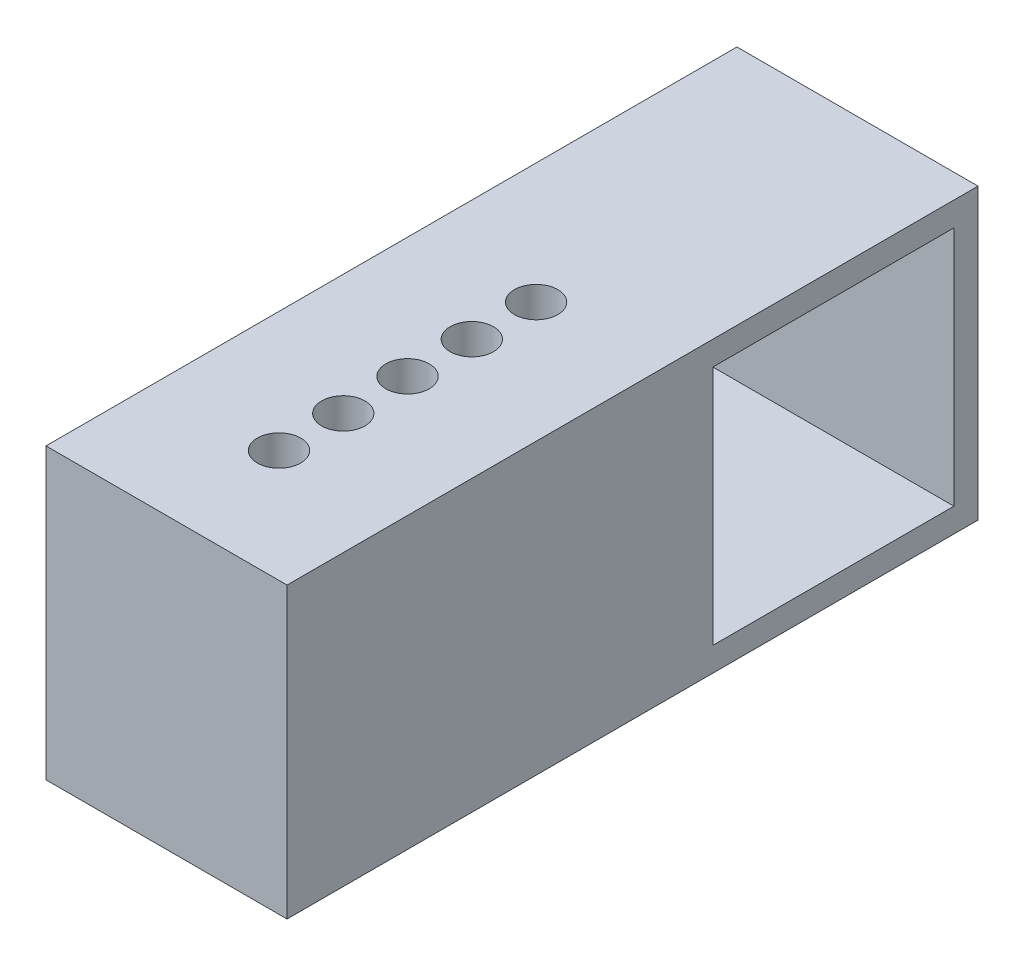
ISO-10303-21;
HEADER;
FILE_DESCRIPTION(('STEP AP214'),'2;1');
FILE_NAME('part.step','',(''),(''),'','','');
FILE_SCHEMA(('AUTOMOTIVE_DESIGN { 1 0 10303 214 1 1 1 1 }'));
ENDSEC;
DATA;
#1=APPLICATION_CONTEXT('core data for automotive mechanical design processes');
#2=APPLICATION_PROTOCOL_DEFINITION('international standard','automotive_design',2000,#1);
#3=PRODUCT_CONTEXT('',#1,'mechanical');
#4=PRODUCT('Part','Part','',(#3));
#5=PRODUCT_RELATED_PRODUCT_CATEGORY('part','',(#4));
#6=PRODUCT_DEFINITION_FORMATION('','',#4);
#7=PRODUCT_DEFINITION_CONTEXT('part definition',#1,'design');
#8=PRODUCT_DEFINITION('design','',#6,#7);
#9=PRODUCT_DEFINITION_SHAPE('','',#8);
#10=(LENGTH_UNIT() NAMED_UNIT(*) SI_UNIT(.MILLI.,.METRE.));
#11=(NAMED_UNIT(*) PLANE_ANGLE_UNIT() SI_UNIT($,.RADIAN.));
#12=(NAMED_UNIT(*) SI_UNIT($,.STERADIAN.) SOLID_ANGLE_UNIT());
#13=UNCERTAINTY_MEASURE_WITH_UNIT(LENGTH_MEASURE(1.E-05),#10,'distance_accuracy_value','');
#14=(GEOMETRIC_REPRESENTATION_CONTEXT(3) GLOBAL_UNCERTAINTY_ASSIGNED_CONTEXT((#13)) GLOBAL_UNIT_ASSIGNED_CONTEXT((#10,
#11,#12)) REPRESENTATION_CONTEXT('',''));
#15=CARTESIAN_POINT('',(0.,0.,0.));
#16=DIRECTION('',(0.,0.,1.));
#17=DIRECTION('',(1.,0.,0.));
#18=AXIS2_PLACEMENT_3D('',#15,#16,#17);
#19=CARTESIAN_POINT('',(15.,0.,-7.5));
#20=DIRECTION('',(0.,0.,1.));
#21=DIRECTION('',(1.,0.,0.));
#22=AXIS2_PLACEMENT_3D('',#19,#20,#21);
#23=PLANE('',#22);
#24=DIRECTION('',(0.,1.,0.));
#25=VECTOR('',#24,1.);
#26=CARTESIAN_POINT('',(0.,0.,-7.5));
#27=LINE('',#26,#25);
#28=CARTESIAN_POINT('',(0.,-7.5,-7.5));
#29=VERTEX_POINT('',#28);
#30=CARTESIAN_POINT('',(0.,7.5,-7.5));
#31=VERTEX_POINT('',#30);
#32=EDGE_CURVE('E165',#29,#31,#27,.T.);
#33=ORIENTED_EDGE('',*,*,#32,.F.);
#34=DIRECTION('',(-1.,0.,0.));
#35=VECTOR('',#34,1.);
#36=CARTESIAN_POINT('',(15.,-7.5,-7.5));
#37=LINE('',#36,#35);
#38=CARTESIAN_POINT('',(15.,-7.5,-7.5));
#39=VERTEX_POINT('',#38);
#40=EDGE_CURVE('E11',#39,#29,#37,.T.);
#41=ORIENTED_EDGE('',*,*,#40,.F.);
#42=DIRECTION('',(0.,1.,0.));
#43=VECTOR('',#42,1.);
#44=CARTESIAN_POINT('',(15.,0.,-7.5));
#45=LINE('',#44,#43);
#46=CARTESIAN_POINT('',(15.,7.5,-7.5));
#47=VERTEX_POINT('',#46);
#48=EDGE_CURVE('E141',#39,#47,#45,.T.);
#49=ORIENTED_EDGE('',*,*,#48,.T.);
#50=DIRECTION('',(-1.,0.,0.));
#51=VECTOR('',#50,1.);
#52=CARTESIAN_POINT('',(15.,7.5,-7.5));
#53=LINE('',#52,#51);
#54=EDGE_CURVE('E100',#47,#31,#53,.T.);
#55=ORIENTED_EDGE('',*,*,#54,.T.);
#56=EDGE_LOOP('',(#33,#41,#49,#55));
#57=FACE_BOUND('',#56,.T.);
#58=ADVANCED_FACE('F45',(#57),#23,.T.);
#59=CARTESIAN_POINT('',(15.,-7.5,0.));
#60=DIRECTION('',(0.,1.,0.));
#61=DIRECTION('',(0.,0.,1.));
#62=AXIS2_PLACEMENT_3D('',#59,#60,#61);
#63=PLANE('',#62);
#64=DIRECTION('',(0.,0.,-1.));
#65=VECTOR('',#64,1.);
#66=CARTESIAN_POINT('',(0.,-7.5,0.));
#67=LINE('',#66,#65);
#68=CARTESIAN_POINT('',(0.,-7.5,7.5));
#69=VERTEX_POINT('',#68);
#70=EDGE_CURVE('E129',#69,#29,#67,.T.);
#71=ORIENTED_EDGE('',*,*,#70,.F.);
#72=DIRECTION('',(-1.,0.,0.));
#73=VECTOR('',#72,1.);
#74=CARTESIAN_POINT('',(15.,-7.5,7.5));
#75=LINE('',#74,#73);
#76=CARTESIAN_POINT('',(15.,-7.5,7.5));
#77=VERTEX_POINT('',#76);
#78=EDGE_CURVE('E56',#77,#69,#75,.T.);
#79=ORIENTED_EDGE('',*,*,#78,.F.);
#80=DIRECTION('',(0.,0.,-1.));
#81=VECTOR('',#80,1.);
#82=CARTESIAN_POINT('',(15.,-7.5,0.));
#83=LINE('',#82,#81);
#84=EDGE_CURVE('E127',#77,#39,#83,.T.);
#85=ORIENTED_EDGE('',*,*,#84,.T.);
#86=ORIENTED_EDGE('',*,*,#40,.T.);
#87=EDGE_LOOP('',(#71,#79,#85,#86));
#88=FACE_BOUND('',#87,.T.);
#89=ADVANCED_FACE('F125',(#88),#63,.T.);
#90=CARTESIAN_POINT('',(15.,0.,7.5));
#91=DIRECTION('',(0.,0.,1.));
#92=DIRECTION('',(1.,0.,0.));
#93=AXIS2_PLACEMENT_3D('',#90,#91,#92);
#94=PLANE('',#93);
#95=DIRECTION('',(0.,1.,0.));
#96=VECTOR('',#95,1.);
#97=CARTESIAN_POINT('',(0.,0.,7.5));
#98=LINE('',#97,#96);
#99=CARTESIAN_POINT('',(0.,7.5,7.5));
#100=VERTEX_POINT('',#99);
#101=EDGE_CURVE('E170',#69,#100,#98,.T.);
#102=ORIENTED_EDGE('',*,*,#101,.T.);
#103=DIRECTION('',(-1.,0.,0.));
#104=VECTOR('',#103,1.);
#105=CARTESIAN_POINT('',(15.,7.5,7.5));
#106=LINE('',#105,#104);
#107=CARTESIAN_POINT('',(15.,7.5,7.5));
#108=VERTEX_POINT('',#107);
#109=EDGE_CURVE('E133',#108,#100,#106,.T.);
#110=ORIENTED_EDGE('',*,*,#109,.F.);
#111=DIRECTION('',(0.,1.,0.));
#112=VECTOR('',#111,1.);
#113=CARTESIAN_POINT('',(15.,0.,7.5));
#114=LINE('',#113,#112);
#115=EDGE_CURVE('E136',#77,#108,#114,.T.);
#116=ORIENTED_EDGE('',*,*,#115,.F.);
#117=ORIENTED_EDGE('',*,*,#78,.T.);
#118=EDGE_LOOP('',(#102,#110,#116,#117));
#119=FACE_BOUND('',#118,.T.);
#120=ADVANCED_FACE('F137',(#119),#94,.F.);
#121=CARTESIAN_POINT('',(15.,0.,34.));
#122=DIRECTION('',(0.,0.,-1.));
#123=DIRECTION('',(0.,1.,0.));
#124=AXIS2_PLACEMENT_3D('',#121,#122,#123);
#125=PLANE('',#124);
#126=DIRECTION('',(0.,-1.,0.));
#127=VECTOR('',#126,1.);
#128=CARTESIAN_POINT('',(0.,0.,34.));
#129=LINE('',#128,#127);
#130=CARTESIAN_POINT('',(0.,9.,34.));
#131=VERTEX_POINT('',#130);
#132=CARTESIAN_POINT('',(0.,-9.,34.));
#133=VERTEX_POINT('',#132);
#134=EDGE_CURVE('E152',#131,#133,#129,.T.);
#135=ORIENTED_EDGE('',*,*,#134,.T.);
#136=DIRECTION('',(-1.,0.,0.));
#137=VECTOR('',#136,1.);
#138=CARTESIAN_POINT('',(15.,-9.,34.));
#139=LINE('',#138,#137);
#140=CARTESIAN_POINT('',(15.,-9.,34.));
#141=VERTEX_POINT('',#140);
#142=EDGE_CURVE('E178',#141,#133,#139,.T.);
#143=ORIENTED_EDGE('',*,*,#142,.F.);
#144=DIRECTION('',(0.,-1.,0.));
#145=VECTOR('',#144,1.);
#146=CARTESIAN_POINT('',(15.,0.,34.));
#147=LINE('',#146,#145);
#148=CARTESIAN_POINT('',(15.,9.,34.));
#149=VERTEX_POINT('',#148);
#150=EDGE_CURVE('E175',#149,#141,#147,.T.);
#151=ORIENTED_EDGE('',*,*,#150,.F.);
#152=DIRECTION('',(-1.,0.,0.));
#153=VECTOR('',#152,1.);
#154=CARTESIAN_POINT('',(15.,9.,34.));
#155=LINE('',#154,#153);
#156=EDGE_CURVE('E151',#149,#131,#155,.T.);
#157=ORIENTED_EDGE('',*,*,#156,.T.);
#158=EDGE_LOOP('',(#135,#143,#151,#157));
#159=FACE_BOUND('',#158,.T.);
#160=ADVANCED_FACE('F47',(#159),#125,.F.);
#161=CARTESIAN_POINT('',(15.,-9.,0.));
#162=DIRECTION('',(0.,1.,0.));
#163=DIRECTION('',(0.,0.,1.));
#164=AXIS2_PLACEMENT_3D('',#161,#162,#163);
#165=PLANE('',#164);
#166=CARTESIAN_POINT('',(7.5,-9.,31.));
#167=DIRECTION('',(0.,-1.,0.));
#168=DIRECTION('',(0.,0.,-1.));
#169=AXIS2_PLACEMENT_3D('',#166,#167,#168);
#170=CIRCLE('',#169,1.35);
#171=CARTESIAN_POINT('',(7.5,-9.,29.65));
#172=VERTEX_POINT('',#171);
#173=EDGE_CURVE('E255',#172,#172,#170,.T.);
#174=ORIENTED_EDGE('',*,*,#173,.F.);
#175=EDGE_LOOP('',(#174));
#176=FACE_BOUND('',#175,.T.);
#177=CARTESIAN_POINT('',(7.49999999999994,-9.00000000000001,15.));
#178=DIRECTION('',(0.,1.,0.));
#179=DIRECTION('',(0.,0.,1.));
#180=AXIS2_PLACEMENT_3D('',#177,#178,#179);
#181=CIRCLE('',#180,1.35);
#182=CARTESIAN_POINT('',(7.49999999999994,-9.00000000000001,16.35));
#183=VERTEX_POINT('',#182);
#184=EDGE_CURVE('E199',#183,#183,#181,.T.);
#185=ORIENTED_EDGE('',*,*,#184,.T.);
#186=EDGE_LOOP('',(#185));
#187=FACE_BOUND('',#186,.T.);
#188=CARTESIAN_POINT('',(7.49999999999996,-9.00000000000001,19.));
#189=DIRECTION('',(0.,1.,0.));
#190=DIRECTION('',(0.,0.,1.));
#191=AXIS2_PLACEMENT_3D('',#188,#189,#190);
#192=CIRCLE('',#191,1.35);
#193=CARTESIAN_POINT('',(7.49999999999996,-9.00000000000001,20.35));
#194=VERTEX_POINT('',#193);
#195=EDGE_CURVE('E261',#194,#194,#192,.T.);
#196=ORIENTED_EDGE('',*,*,#195,.T.);
#197=EDGE_LOOP('',(#196));
#198=FACE_BOUND('',#197,.T.);
#199=CARTESIAN_POINT('',(7.49999999999997,-9.00000000000001,23.));
#200=DIRECTION('',(0.,1.,0.));
#201=DIRECTION('',(0.,0.,1.));
#202=AXIS2_PLACEMENT_3D('',#199,#200,#201);
#203=CIRCLE('',#202,1.35);
#204=CARTESIAN_POINT('',(7.49999999999997,-9.00000000000001,24.35));
#205=VERTEX_POINT('',#204);
#206=EDGE_CURVE('E265',#205,#205,#203,.T.);
#207=ORIENTED_EDGE('',*,*,#206,.T.);
#208=EDGE_LOOP('',(#207));
#209=FACE_BOUND('',#208,.T.);
#210=CARTESIAN_POINT('',(7.49999999999999,-9.00000000000001,27.));
#211=DIRECTION('',(0.,1.,0.));
#212=DIRECTION('',(0.,0.,1.));
#213=AXIS2_PLACEMENT_3D('',#210,#211,#212);
#214=CIRCLE('',#213,1.35);
#215=CARTESIAN_POINT('',(7.49999999999999,-9.00000000000001,28.35));
#216=VERTEX_POINT('',#215);
#217=EDGE_CURVE('E268',#216,#216,#214,.T.);
#218=ORIENTED_EDGE('',*,*,#217,.T.);
#219=EDGE_LOOP('',(#218));
#220=FACE_BOUND('',#219,.T.);
#221=DIRECTION('',(0.,0.,-1.));
#222=VECTOR('',#221,1.);
#223=CARTESIAN_POINT('',(0.,-9.,0.));
#224=LINE('',#223,#222);
#225=CARTESIAN_POINT('',(0.,-9.,-9.));
#226=VERTEX_POINT('',#225);
#227=EDGE_CURVE('E156',#133,#226,#224,.T.);
#228=ORIENTED_EDGE('',*,*,#227,.T.);
#229=DIRECTION('',(-1.,0.,0.));
#230=VECTOR('',#229,1.);
#231=CARTESIAN_POINT('',(15.,-9.,-9.));
#232=LINE('',#231,#230);
#233=CARTESIAN_POINT('',(15.,-9.,-9.));
#234=VERTEX_POINT('',#233);
#235=EDGE_CURVE('E188',#234,#226,#232,.T.);
#236=ORIENTED_EDGE('',*,*,#235,.F.);
#237=DIRECTION('',(0.,0.,-1.));
#238=VECTOR('',#237,1.);
#239=CARTESIAN_POINT('',(15.,-9.,0.));
#240=LINE('',#239,#238);
#241=EDGE_CURVE('E108',#141,#234,#240,.T.);
#242=ORIENTED_EDGE('',*,*,#241,.F.);
#243=ORIENTED_EDGE('',*,*,#142,.T.);
#244=EDGE_LOOP('',(#228,#236,#242,#243));
#245=FACE_BOUND('',#244,.T.);
#246=ADVANCED_FACE('F244',(#176,#187,#198,#209,#220,#245),#165,.F.);
#247=CARTESIAN_POINT('',(15.,0.,-9.));
#248=DIRECTION('',(0.,0.,1.));
#249=DIRECTION('',(1.,0.,0.));
#250=AXIS2_PLACEMENT_3D('',#247,#248,#249);
#251=PLANE('',#250);
#252=DIRECTION('',(0.,1.,0.));
#253=VECTOR('',#252,1.);
#254=CARTESIAN_POINT('',(0.,0.,-9.));
#255=LINE('',#254,#253);
#256=CARTESIAN_POINT('',(0.,9.,-9.));
#257=VERTEX_POINT('',#256);
#258=EDGE_CURVE('E159',#226,#257,#255,.T.);
#259=ORIENTED_EDGE('',*,*,#258,.T.);
#260=DIRECTION('',(-1.,0.,0.));
#261=VECTOR('',#260,1.);
#262=CARTESIAN_POINT('',(15.,9.,-9.));
#263=LINE('',#262,#261);
#264=CARTESIAN_POINT('',(15.,9.,-9.));
#265=VERTEX_POINT('',#264);
#266=EDGE_CURVE('E184',#265,#257,#263,.T.);
#267=ORIENTED_EDGE('',*,*,#266,.F.);
#268=DIRECTION('',(0.,1.,0.));
#269=VECTOR('',#268,1.);
#270=CARTESIAN_POINT('',(15.,0.,-9.));
#271=LINE('',#270,#269);
#272=EDGE_CURVE('E275',#234,#265,#271,.T.);
#273=ORIENTED_EDGE('',*,*,#272,.F.);
#274=ORIENTED_EDGE('',*,*,#235,.T.);
#275=EDGE_LOOP('',(#259,#267,#273,#274));
#276=FACE_BOUND('',#275,.T.);
#277=ADVANCED_FACE('F241',(#276),#251,.F.);
#278=CARTESIAN_POINT('',(15.,9.,0.));
#279=DIRECTION('',(0.,-1.,0.));
#280=DIRECTION('',(0.,0.,-1.));
#281=AXIS2_PLACEMENT_3D('',#278,#279,#280);
#282=PLANE('',#281);
#283=CARTESIAN_POINT('',(7.5,9.,11.));
#284=DIRECTION('',(0.,1.,0.));
#285=DIRECTION('',(0.,0.,1.));
#286=AXIS2_PLACEMENT_3D('',#283,#284,#285);
#287=CIRCLE('',#286,1.35);
#288=CARTESIAN_POINT('',(7.5,9.,12.35));
#289=VERTEX_POINT('',#288);
#290=EDGE_CURVE('E472',#289,#289,#287,.T.);
#291=ORIENTED_EDGE('',*,*,#290,.F.);
#292=EDGE_LOOP('',(#291));
#293=FACE_BOUND('',#292,.T.);
#294=CARTESIAN_POINT('',(7.49999999999994,9.,15.));
#295=DIRECTION('',(0.,-1.,0.));
#296=DIRECTION('',(0.,0.,-1.));
#297=AXIS2_PLACEMENT_3D('',#294,#295,#296);
#298=CIRCLE('',#297,1.35);
#299=CARTESIAN_POINT('',(7.49999999999994,9.,13.65));
#300=VERTEX_POINT('',#299);
#301=EDGE_CURVE('E49',#300,#300,#298,.T.);
#302=ORIENTED_EDGE('',*,*,#301,.T.);
#303=EDGE_LOOP('',(#302));
#304=FACE_BOUND('',#303,.T.);
#305=CARTESIAN_POINT('',(7.49999999999996,9.,19.));
#306=DIRECTION('',(0.,-1.,0.));
#307=DIRECTION('',(0.,0.,-1.));
#308=AXIS2_PLACEMENT_3D('',#305,#306,#307);
#309=CIRCLE('',#308,1.35);
#310=CARTESIAN_POINT('',(7.49999999999996,9.,17.65));
#311=VERTEX_POINT('',#310);
#312=EDGE_CURVE('E202',#311,#311,#309,.T.);
#313=ORIENTED_EDGE('',*,*,#312,.T.);
#314=EDGE_LOOP('',(#313));
#315=FACE_BOUND('',#314,.T.);
#316=CARTESIAN_POINT('',(7.49999999999997,9.,23.));
#317=DIRECTION('',(0.,-1.,0.));
#318=DIRECTION('',(0.,0.,-1.));
#319=AXIS2_PLACEMENT_3D('',#316,#317,#318);
#320=CIRCLE('',#319,1.35);
#321=CARTESIAN_POINT('',(7.49999999999997,9.,21.65));
#322=VERTEX_POINT('',#321);
#323=EDGE_CURVE('E198',#322,#322,#320,.T.);
#324=ORIENTED_EDGE('',*,*,#323,.T.);
#325=EDGE_LOOP('',(#324));
#326=FACE_BOUND('',#325,.T.);
#327=CARTESIAN_POINT('',(7.49999999999999,8.99999999999999,27.));
#328=DIRECTION('',(0.,-1.,0.));
#329=DIRECTION('',(0.,0.,-1.));
#330=AXIS2_PLACEMENT_3D('',#327,#328,#329);
#331=CIRCLE('',#330,1.35);
#332=CARTESIAN_POINT('',(7.49999999999999,8.99999999999999,25.65));
#333=VERTEX_POINT('',#332);
#334=EDGE_CURVE('E194',#333,#333,#331,.T.);
#335=ORIENTED_EDGE('',*,*,#334,.T.);
#336=EDGE_LOOP('',(#335));
#337=FACE_BOUND('',#336,.T.);
#338=DIRECTION('',(0.,0.,1.));
#339=VECTOR('',#338,1.);
#340=CARTESIAN_POINT('',(0.,9.,0.));
#341=LINE('',#340,#339);
#342=EDGE_CURVE('E162',#257,#131,#341,.T.);
#343=ORIENTED_EDGE('',*,*,#342,.T.);
#344=ORIENTED_EDGE('',*,*,#156,.F.);
#345=DIRECTION('',(0.,0.,1.));
#346=VECTOR('',#345,1.);
#347=CARTESIAN_POINT('',(15.,9.,0.));
#348=LINE('',#347,#346);
#349=EDGE_CURVE('E145',#265,#149,#348,.T.);
#350=ORIENTED_EDGE('',*,*,#349,.F.);
#351=ORIENTED_EDGE('',*,*,#266,.T.);
#352=EDGE_LOOP('',(#343,#344,#350,#351));
#353=FACE_BOUND('',#352,.T.);
#354=ADVANCED_FACE('F211',(#293,#304,#315,#326,#337,#353),#282,.F.);
#355=CARTESIAN_POINT('',(15.,7.5,0.));
#356=DIRECTION('',(0.,1.,0.));
#357=DIRECTION('',(0.,0.,1.));
#358=AXIS2_PLACEMENT_3D('',#355,#356,#357);
#359=PLANE('',#358);
#360=DIRECTION('',(0.,0.,-1.));
#361=VECTOR('',#360,1.);
#362=CARTESIAN_POINT('',(0.,7.5,0.));
#363=LINE('',#362,#361);
#364=EDGE_CURVE('E93',#100,#31,#363,.T.);
#365=ORIENTED_EDGE('',*,*,#364,.T.);
#366=ORIENTED_EDGE('',*,*,#54,.F.);
#367=DIRECTION('',(0.,0.,-1.));
#368=VECTOR('',#367,1.);
#369=CARTESIAN_POINT('',(15.,7.5,0.));
#370=LINE('',#369,#368);
#371=EDGE_CURVE('E65',#108,#47,#370,.T.);
#372=ORIENTED_EDGE('',*,*,#371,.F.);
#373=ORIENTED_EDGE('',*,*,#109,.T.);
#374=EDGE_LOOP('',(#365,#366,#372,#373));
#375=FACE_BOUND('',#374,.T.);
#376=ADVANCED_FACE('F240',(#375),#359,.F.);
#377=CARTESIAN_POINT('',(15.,0.,0.));
#378=DIRECTION('',(1.,0.,0.));
#379=DIRECTION('',(0.,0.,-1.));
#380=AXIS2_PLACEMENT_3D('',#377,#378,#379);
#381=PLANE('',#380);
#382=ORIENTED_EDGE('',*,*,#150,.T.);
#383=ORIENTED_EDGE('',*,*,#241,.T.);
#384=ORIENTED_EDGE('',*,*,#272,.T.);
#385=ORIENTED_EDGE('',*,*,#349,.T.);
#386=EDGE_LOOP('',(#382,#383,#384,#385));
#387=FACE_BOUND('',#386,.T.);
#388=ORIENTED_EDGE('',*,*,#48,.F.);
#389=ORIENTED_EDGE('',*,*,#84,.F.);
#390=ORIENTED_EDGE('',*,*,#115,.T.);
#391=ORIENTED_EDGE('',*,*,#371,.T.);
#392=EDGE_LOOP('',(#388,#389,#390,#391));
#393=FACE_BOUND('',#392,.T.);
#394=ADVANCED_FACE('F140',(#387,#393),#381,.T.);
#395=CARTESIAN_POINT('',(0.,0.,0.));
#396=DIRECTION('',(1.,0.,0.));
#397=DIRECTION('',(0.,0.,-1.));
#398=AXIS2_PLACEMENT_3D('',#395,#396,#397);
#399=PLANE('',#398);
#400=ORIENTED_EDGE('',*,*,#134,.F.);
#401=ORIENTED_EDGE('',*,*,#342,.F.);
#402=ORIENTED_EDGE('',*,*,#258,.F.);
#403=ORIENTED_EDGE('',*,*,#227,.F.);
#404=EDGE_LOOP('',(#400,#401,#402,#403));
#405=FACE_BOUND('',#404,.T.);
#406=ORIENTED_EDGE('',*,*,#32,.T.);
#407=ORIENTED_EDGE('',*,*,#364,.F.);
#408=ORIENTED_EDGE('',*,*,#101,.F.);
#409=ORIENTED_EDGE('',*,*,#70,.T.);
#410=EDGE_LOOP('',(#406,#407,#408,#409));
#411=FACE_BOUND('',#410,.T.);
#412=ADVANCED_FACE('F277',(#405,#411),#399,.F.);
#413=CARTESIAN_POINT('',(7.49999999999999,-9.00000000000001,27.));
#414=DIRECTION('',(0.,1.,0.));
#415=DIRECTION('',(0.,0.,1.));
#416=AXIS2_PLACEMENT_3D('',#413,#414,#415);
#417=CYLINDRICAL_SURFACE('',#416,1.35);
#418=ORIENTED_EDGE('',*,*,#217,.F.);
#419=EDGE_LOOP('',(#418));
#420=FACE_BOUND('',#419,.T.);
#421=ORIENTED_EDGE('',*,*,#334,.F.);
#422=EDGE_LOOP('',(#421));
#423=FACE_BOUND('',#422,.T.);
#424=ADVANCED_FACE('F298',(#420,#423),#417,.F.);
#425=CARTESIAN_POINT('',(7.49999999999997,-9.00000000000001,23.));
#426=DIRECTION('',(0.,1.,0.));
#427=DIRECTION('',(0.,0.,1.));
#428=AXIS2_PLACEMENT_3D('',#425,#426,#427);
#429=CYLINDRICAL_SURFACE('',#428,1.35);
#430=ORIENTED_EDGE('',*,*,#206,.F.);
#431=EDGE_LOOP('',(#430));
#432=FACE_BOUND('',#431,.T.);
#433=ORIENTED_EDGE('',*,*,#323,.F.);
#434=EDGE_LOOP('',(#433));
#435=FACE_BOUND('',#434,.T.);
#436=ADVANCED_FACE('F226',(#432,#435),#429,.F.);
#437=CARTESIAN_POINT('',(7.49999999999996,-9.00000000000001,19.));
#438=DIRECTION('',(0.,1.,0.));
#439=DIRECTION('',(0.,0.,1.));
#440=AXIS2_PLACEMENT_3D('',#437,#438,#439);
#441=CYLINDRICAL_SURFACE('',#440,1.35);
#442=ORIENTED_EDGE('',*,*,#195,.F.);
#443=EDGE_LOOP('',(#442));
#444=FACE_BOUND('',#443,.T.);
#445=ORIENTED_EDGE('',*,*,#312,.F.);
#446=EDGE_LOOP('',(#445));
#447=FACE_BOUND('',#446,.T.);
#448=ADVANCED_FACE('F216',(#444,#447),#441,.F.);
#449=CARTESIAN_POINT('',(7.49999999999994,-9.00000000000001,15.));
#450=DIRECTION('',(0.,1.,0.));
#451=DIRECTION('',(0.,0.,1.));
#452=AXIS2_PLACEMENT_3D('',#449,#450,#451);
#453=CYLINDRICAL_SURFACE('',#452,1.35);
#454=ORIENTED_EDGE('',*,*,#184,.F.);
#455=EDGE_LOOP('',(#454));
#456=FACE_BOUND('',#455,.T.);
#457=ORIENTED_EDGE('',*,*,#301,.F.);
#458=EDGE_LOOP('',(#457));
#459=FACE_BOUND('',#458,.T.);
#460=ADVANCED_FACE('F213',(#456,#459),#453,.F.);
#461=CARTESIAN_POINT('',(7.5,-6.,11.));
#462=DIRECTION('',(0.,1.,0.));
#463=DIRECTION('',(0.,0.,1.));
#464=AXIS2_PLACEMENT_3D('',#461,#462,#463);
#465=CYLINDRICAL_SURFACE('',#464,1.35);
#466=CARTESIAN_POINT('',(7.5,-6.,11.));
#467=DIRECTION('',(0.,1.,0.));
#468=DIRECTION('',(0.,0.,1.));
#469=AXIS2_PLACEMENT_3D('',#466,#467,#468);
#470=CIRCLE('',#469,1.35);
#471=CARTESIAN_POINT('',(7.5,-6.,12.35));
#472=VERTEX_POINT('',#471);
#473=EDGE_CURVE('E477',#472,#472,#470,.T.);
#474=ORIENTED_EDGE('',*,*,#473,.F.);
#475=EDGE_LOOP('',(#474));
#476=FACE_BOUND('',#475,.T.);
#477=ORIENTED_EDGE('',*,*,#290,.T.);
#478=EDGE_LOOP('',(#477));
#479=FACE_BOUND('',#478,.T.);
#480=ADVANCED_FACE('F215',(#476,#479),#465,.F.);
#481=CARTESIAN_POINT('',(7.5,-6.,11.));
#482=DIRECTION('',(0.,1.,0.));
#483=DIRECTION('',(0.,0.,1.));
#484=AXIS2_PLACEMENT_3D('',#481,#482,#483);
#485=PLANE('',#484);
#486=ORIENTED_EDGE('',*,*,#473,.T.);
#487=EDGE_LOOP('',(#486));
#488=FACE_BOUND('',#487,.T.);
#489=ADVANCED_FACE('F223',(#488),#485,.T.);
#490=CARTESIAN_POINT('',(7.5,6.,31.));
#491=DIRECTION('',(0.,-1.,0.));
#492=DIRECTION('',(0.,0.,-1.));
#493=AXIS2_PLACEMENT_3D('',#490,#491,#492);
#494=CYLINDRICAL_SURFACE('',#493,1.35);
#495=CARTESIAN_POINT('',(7.5,6.,31.));
#496=DIRECTION('',(0.,-1.,0.));
#497=DIRECTION('',(0.,0.,-1.));
#498=AXIS2_PLACEMENT_3D('',#495,#496,#497);
#499=CIRCLE('',#498,1.35);
#500=CARTESIAN_POINT('',(7.5,6.,29.65));
#501=VERTEX_POINT('',#500);
#502=EDGE_CURVE('E470',#501,#501,#499,.T.);
#503=ORIENTED_EDGE('',*,*,#502,.F.);
#504=EDGE_LOOP('',(#503));
#505=FACE_BOUND('',#504,.T.);
#506=ORIENTED_EDGE('',*,*,#173,.T.);
#507=EDGE_LOOP('',(#506));
#508=FACE_BOUND('',#507,.T.);
#509=ADVANCED_FACE('F394',(#505,#508),#494,.F.);
#510=CARTESIAN_POINT('',(7.5,6.,31.));
#511=DIRECTION('',(0.,-1.,0.));
#512=DIRECTION('',(0.,0.,-1.));
#513=AXIS2_PLACEMENT_3D('',#510,#511,#512);
#514=PLANE('',#513);
#515=ORIENTED_EDGE('',*,*,#502,.T.);
#516=EDGE_LOOP('',(#515));
#517=FACE_BOUND('',#516,.T.);
#518=ADVANCED_FACE('F409',(#517),#514,.T.);
#519=CLOSED_SHELL('',(#58,#89,#120,#160,#246,#277,#354,#376,#394,#412,#424,#436,#448,#460,#480,
#489,#509,#518));
#520=MANIFOLD_SOLID_BREP('B2',#519);
#521=ADVANCED_BREP_SHAPE_REPRESENTATION('',(#18,#520),#14);
#522=SHAPE_DEFINITION_REPRESENTATION(#9,#521);
ENDSEC;
END-ISO-10303-21;
